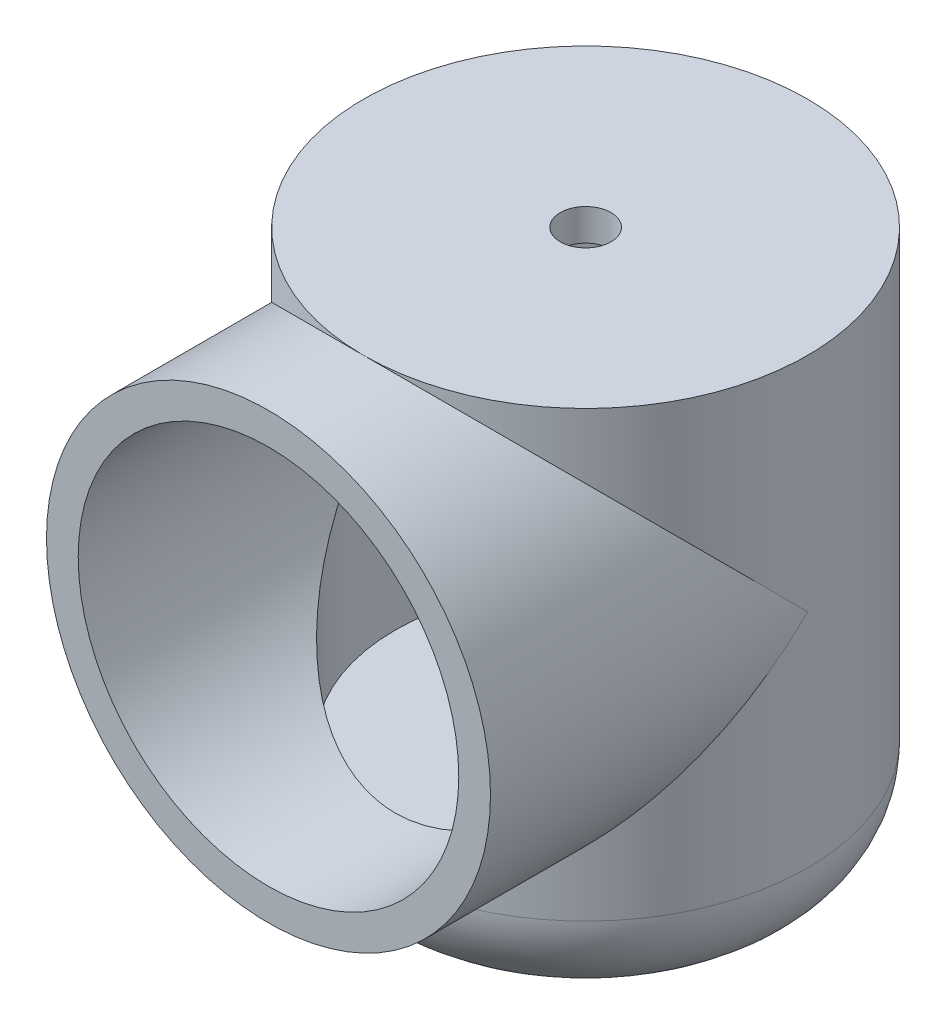
ISO-10303-21;
HEADER;
FILE_DESCRIPTION(('STEP AP214'),'2;1');
FILE_NAME('part.step','',(''),(''),'','','');
FILE_SCHEMA(('AUTOMOTIVE_DESIGN { 1 0 10303 214 1 1 1 1 }'));
ENDSEC;
DATA;
#1=APPLICATION_CONTEXT('core data for automotive mechanical design processes');
#2=APPLICATION_PROTOCOL_DEFINITION('international standard','automotive_design',2000,#1);
#3=PRODUCT_CONTEXT('',#1,'mechanical');
#4=PRODUCT('Part','Part','',(#3));
#5=PRODUCT_RELATED_PRODUCT_CATEGORY('part','',(#4));
#6=PRODUCT_DEFINITION_FORMATION('','',#4);
#7=PRODUCT_DEFINITION_CONTEXT('part definition',#1,'design');
#8=PRODUCT_DEFINITION('design','',#6,#7);
#9=PRODUCT_DEFINITION_SHAPE('','',#8);
#10=(LENGTH_UNIT() NAMED_UNIT(*) SI_UNIT(.MILLI.,.METRE.));
#11=(NAMED_UNIT(*) PLANE_ANGLE_UNIT() SI_UNIT($,.RADIAN.));
#12=(NAMED_UNIT(*) SI_UNIT($,.STERADIAN.) SOLID_ANGLE_UNIT());
#13=UNCERTAINTY_MEASURE_WITH_UNIT(LENGTH_MEASURE(1.E-05),#10,'distance_accuracy_value','');
#14=(GEOMETRIC_REPRESENTATION_CONTEXT(3) GLOBAL_UNCERTAINTY_ASSIGNED_CONTEXT((#13)) GLOBAL_UNIT_ASSIGNED_CONTEXT((#10,
#11,#12)) REPRESENTATION_CONTEXT('',''));
#15=CARTESIAN_POINT('',(0.,0.,0.));
#16=DIRECTION('',(0.,0.,1.));
#17=DIRECTION('',(1.,0.,0.));
#18=AXIS2_PLACEMENT_3D('',#15,#16,#17);
#19=CARTESIAN_POINT('',(0.,15.,0.));
#20=DIRECTION('',(0.,1.,0.));
#21=DIRECTION('',(0.,0.,1.));
#22=AXIS2_PLACEMENT_3D('',#19,#20,#21);
#23=CYLINDRICAL_SURFACE('',#22,30.);
#24=CARTESIAN_POINT('',(0.,15.,0.));
#25=DIRECTION('',(0.,1.,0.));
#26=DIRECTION('',(0.,0.,1.));
#27=AXIS2_PLACEMENT_3D('',#24,#25,#26);
#28=CIRCLE('',#27,30.);
#29=CARTESIAN_POINT('',(0.,15.,30.));
#30=VERTEX_POINT('',#29);
#31=EDGE_CURVE('E92',#30,#30,#28,.T.);
#32=ORIENTED_EDGE('',*,*,#31,.F.);
#33=EDGE_LOOP('',(#32));
#34=FACE_BOUND('',#33,.T.);
#35=CARTESIAN_POINT('',(0.,50.,0.));
#36=DIRECTION('',(0.,0.707106781186547,-0.707106781186547));
#37=DIRECTION('',(0.,0.707106781186547,0.707106781186547));
#38=AXIS2_PLACEMENT_3D('',#35,#36,#37);
#39=ELLIPSE('',#38,42.4264068711928,30.);
#40=CARTESIAN_POINT('',(0.,80.,30.));
#41=VERTEX_POINT('',#40);
#42=CARTESIAN_POINT('',(30.,50.,0.));
#43=VERTEX_POINT('',#42);
#44=EDGE_CURVE('E47',#41,#43,#39,.T.);
#45=ORIENTED_EDGE('',*,*,#44,.F.);
#46=CARTESIAN_POINT('',(0.,80.,0.));
#47=DIRECTION('',(0.,1.,0.));
#48=DIRECTION('',(0.,0.,1.));
#49=AXIS2_PLACEMENT_3D('',#46,#47,#48);
#50=CIRCLE('',#49,30.);
#51=EDGE_CURVE('E85',#41,#41,#50,.T.);
#52=ORIENTED_EDGE('',*,*,#51,.T.);
#53=CARTESIAN_POINT('',(-30.,50.,0.));
#54=VERTEX_POINT('',#53);
#55=EDGE_CURVE('E11',#54,#41,#39,.T.);
#56=ORIENTED_EDGE('',*,*,#55,.F.);
#57=CARTESIAN_POINT('',(0.,50.,0.));
#58=DIRECTION('',(0.,0.707106781186547,0.707106781186547));
#59=DIRECTION('',(0.,0.707106781186547,-0.707106781186547));
#60=AXIS2_PLACEMENT_3D('',#57,#58,#59);
#61=ELLIPSE('',#60,42.4264068711928,30.);
#62=EDGE_CURVE('E81',#43,#54,#61,.F.);
#63=ORIENTED_EDGE('',*,*,#62,.F.);
#64=EDGE_LOOP('',(#45,#52,#56,#63));
#65=FACE_BOUND('',#64,.T.);
#66=ADVANCED_FACE('F41',(#34,#65),#23,.F.);
#67=CARTESIAN_POINT('',(0.,85.,0.));
#68=DIRECTION('',(0.,-1.,0.));
#69=DIRECTION('',(0.,0.,-1.));
#70=AXIS2_PLACEMENT_3D('',#67,#68,#69);
#71=CYLINDRICAL_SURFACE('',#70,35.);
#72=CARTESIAN_POINT('',(0.,50.,0.));
#73=DIRECTION('',(0.,0.707106781186547,0.707106781186547));
#74=DIRECTION('',(0.,-0.707106781186547,0.707106781186547));
#75=AXIS2_PLACEMENT_3D('',#72,#73,#74);
#76=ELLIPSE('',#75,49.4974746830583,35.);
#77=CARTESIAN_POINT('',(-35.,50.,0.));
#78=VERTEX_POINT('',#77);
#79=CARTESIAN_POINT('',(0.,15.,35.));
#80=VERTEX_POINT('',#79);
#81=EDGE_CURVE('E102',#78,#80,#76,.T.);
#82=ORIENTED_EDGE('',*,*,#81,.F.);
#83=CARTESIAN_POINT('',(0.,50.,0.));
#84=DIRECTION('',(0.,-0.707106781186547,0.707106781186547));
#85=DIRECTION('',(0.,0.707106781186547,0.707106781186547));
#86=AXIS2_PLACEMENT_3D('',#83,#84,#85);
#87=ELLIPSE('',#86,49.4974746830583,35.);
#88=CARTESIAN_POINT('',(0.,85.,35.));
#89=VERTEX_POINT('',#88);
#90=EDGE_CURVE('E64',#89,#78,#87,.T.);
#91=ORIENTED_EDGE('',*,*,#90,.F.);
#92=CARTESIAN_POINT('',(0.,85.,0.));
#93=DIRECTION('',(0.,1.,0.));
#94=DIRECTION('',(0.,0.,1.));
#95=AXIS2_PLACEMENT_3D('',#92,#93,#94);
#96=CIRCLE('',#95,35.);
#97=EDGE_CURVE('E91',#89,#89,#96,.T.);
#98=ORIENTED_EDGE('',*,*,#97,.F.);
#99=CARTESIAN_POINT('',(35.,50.,0.));
#100=VERTEX_POINT('',#99);
#101=EDGE_CURVE('E57',#100,#89,#87,.T.);
#102=ORIENTED_EDGE('',*,*,#101,.F.);
#103=EDGE_CURVE('E110',#80,#100,#76,.T.);
#104=ORIENTED_EDGE('',*,*,#103,.F.);
#105=CARTESIAN_POINT('',(0.,15.,0.));
#106=DIRECTION('',(0.,1.,0.));
#107=DIRECTION('',(0.,0.,1.));
#108=AXIS2_PLACEMENT_3D('',#105,#106,#107);
#109=CIRCLE('',#108,35.);
#110=EDGE_CURVE('E86',#80,#80,#109,.T.);
#111=ORIENTED_EDGE('',*,*,#110,.T.);
#112=EDGE_LOOP('',(#82,#91,#98,#102,#104,#111));
#113=FACE_BOUND('',#112,.T.);
#114=ADVANCED_FACE('F129',(#113),#71,.T.);
#115=CARTESIAN_POINT('',(0.,85.,0.));
#116=DIRECTION('',(0.,1.,0.));
#117=DIRECTION('',(0.,0.,1.));
#118=AXIS2_PLACEMENT_3D('',#115,#116,#117);
#119=PLANE('',#118);
#120=ORIENTED_EDGE('',*,*,#97,.T.);
#121=EDGE_LOOP('',(#120));
#122=FACE_BOUND('',#121,.T.);
#123=CARTESIAN_POINT('',(0.,85.,0.));
#124=DIRECTION('',(0.,1.,0.));
#125=DIRECTION('',(0.,0.,1.));
#126=AXIS2_PLACEMENT_3D('',#123,#124,#125);
#127=CIRCLE('',#126,4.);
#128=CARTESIAN_POINT('',(0.,85.,4.));
#129=VERTEX_POINT('',#128);
#130=EDGE_CURVE('E112',#129,#129,#127,.T.);
#131=ORIENTED_EDGE('',*,*,#130,.F.);
#132=EDGE_LOOP('',(#131));
#133=FACE_BOUND('',#132,.T.);
#134=ADVANCED_FACE('F127',(#122,#133),#119,.T.);
#135=CARTESIAN_POINT('',(0.,0.,0.));
#136=DIRECTION('',(0.,1.,0.));
#137=DIRECTION('',(0.,0.,1.));
#138=AXIS2_PLACEMENT_3D('',#135,#136,#137);
#139=PLANE('',#138);
#140=CARTESIAN_POINT('',(0.,0.,0.));
#141=DIRECTION('',(0.,1.,0.));
#142=DIRECTION('',(0.,0.,1.));
#143=AXIS2_PLACEMENT_3D('',#140,#141,#142);
#144=CIRCLE('',#143,20.);
#145=CARTESIAN_POINT('',(0.,0.,20.));
#146=VERTEX_POINT('',#145);
#147=EDGE_CURVE('E88',#146,#146,#144,.F.);
#148=ORIENTED_EDGE('',*,*,#147,.T.);
#149=EDGE_LOOP('',(#148));
#150=FACE_BOUND('',#149,.T.);
#151=ADVANCED_FACE('F126',(#150),#139,.F.);
#152=CARTESIAN_POINT('',(0.,15.,0.));
#153=DIRECTION('',(0.,1.,0.));
#154=DIRECTION('',(0.,0.,1.));
#155=AXIS2_PLACEMENT_3D('',#152,#153,#154);
#156=PLANE('',#155);
#157=ORIENTED_EDGE('',*,*,#31,.T.);
#158=EDGE_LOOP('',(#157));
#159=FACE_BOUND('',#158,.T.);
#160=ADVANCED_FACE('F137',(#159),#156,.T.);
#161=CARTESIAN_POINT('',(0.,15.,0.));
#162=DIRECTION('',(0.,1.,0.));
#163=DIRECTION('',(0.,0.,1.));
#164=AXIS2_PLACEMENT_3D('',#161,#162,#163);
#165=TOROIDAL_SURFACE('',#164,20.,15.);
#166=ORIENTED_EDGE('',*,*,#147,.F.);
#167=EDGE_LOOP('',(#166));
#168=FACE_BOUND('',#167,.T.);
#169=ORIENTED_EDGE('',*,*,#110,.F.);
#170=EDGE_LOOP('',(#169));
#171=FACE_BOUND('',#170,.T.);
#172=ADVANCED_FACE('F43',(#168,#171),#165,.T.);
#173=CARTESIAN_POINT('',(0.,50.,70.));
#174=DIRECTION('',(0.,0.,-1.));
#175=DIRECTION('',(-1.,0.,0.));
#176=AXIS2_PLACEMENT_3D('',#173,#174,#175);
#177=CYLINDRICAL_SURFACE('',#176,30.);
#178=ORIENTED_EDGE('',*,*,#55,.T.);
#179=ORIENTED_EDGE('',*,*,#44,.T.);
#180=ORIENTED_EDGE('',*,*,#62,.T.);
#181=EDGE_LOOP('',(#178,#179,#180));
#182=FACE_BOUND('',#181,.T.);
#183=CARTESIAN_POINT('',(0.,50.,50.));
#184=DIRECTION('',(0.,0.,1.));
#185=DIRECTION('',(1.,0.,0.));
#186=AXIS2_PLACEMENT_3D('',#183,#184,#185);
#187=CIRCLE('',#186,30.);
#188=CARTESIAN_POINT('',(30.,50.,50.));
#189=VERTEX_POINT('',#188);
#190=EDGE_CURVE('E101',#189,#189,#187,.T.);
#191=ORIENTED_EDGE('',*,*,#190,.T.);
#192=EDGE_LOOP('',(#191));
#193=FACE_BOUND('',#192,.T.);
#194=ADVANCED_FACE('F80',(#182,#193),#177,.F.);
#195=CARTESIAN_POINT('',(0.,50.,50.));
#196=DIRECTION('',(0.,0.,1.));
#197=DIRECTION('',(1.,0.,0.));
#198=AXIS2_PLACEMENT_3D('',#195,#196,#197);
#199=PLANE('',#198);
#200=CARTESIAN_POINT('',(0.,50.,50.));
#201=DIRECTION('',(0.,0.,1.));
#202=DIRECTION('',(1.,0.,0.));
#203=AXIS2_PLACEMENT_3D('',#200,#201,#202);
#204=CIRCLE('',#203,35.);
#205=CARTESIAN_POINT('',(35.,50.,50.));
#206=VERTEX_POINT('',#205);
#207=EDGE_CURVE('E98',#206,#206,#204,.T.);
#208=ORIENTED_EDGE('',*,*,#207,.T.);
#209=EDGE_LOOP('',(#208));
#210=FACE_BOUND('',#209,.T.);
#211=ORIENTED_EDGE('',*,*,#190,.F.);
#212=EDGE_LOOP('',(#211));
#213=FACE_BOUND('',#212,.T.);
#214=ADVANCED_FACE('F155',(#210,#213),#199,.T.);
#215=CARTESIAN_POINT('',(0.,50.,50.));
#216=DIRECTION('',(0.,0.,-1.));
#217=DIRECTION('',(-1.,0.,0.));
#218=AXIS2_PLACEMENT_3D('',#215,#216,#217);
#219=CYLINDRICAL_SURFACE('',#218,35.);
#220=ORIENTED_EDGE('',*,*,#207,.F.);
#221=EDGE_LOOP('',(#220));
#222=FACE_BOUND('',#221,.T.);
#223=ORIENTED_EDGE('',*,*,#81,.T.);
#224=ORIENTED_EDGE('',*,*,#103,.T.);
#225=ORIENTED_EDGE('',*,*,#101,.T.);
#226=ORIENTED_EDGE('',*,*,#90,.T.);
#227=EDGE_LOOP('',(#223,#224,#225,#226));
#228=FACE_BOUND('',#227,.T.);
#229=ADVANCED_FACE('F153',(#222,#228),#219,.T.);
#230=CARTESIAN_POINT('',(0.,80.,0.));
#231=DIRECTION('',(0.,1.,0.));
#232=DIRECTION('',(0.,0.,1.));
#233=AXIS2_PLACEMENT_3D('',#230,#231,#232);
#234=PLANE('',#233);
#235=CARTESIAN_POINT('',(0.,80.,0.));
#236=DIRECTION('',(0.,1.,0.));
#237=DIRECTION('',(0.,0.,1.));
#238=AXIS2_PLACEMENT_3D('',#235,#236,#237);
#239=CIRCLE('',#238,4.);
#240=CARTESIAN_POINT('',(0.,80.,4.));
#241=VERTEX_POINT('',#240);
#242=EDGE_CURVE('E109',#241,#241,#239,.T.);
#243=ORIENTED_EDGE('',*,*,#242,.T.);
#244=EDGE_LOOP('',(#243));
#245=FACE_BOUND('',#244,.T.);
#246=ORIENTED_EDGE('',*,*,#51,.F.);
#247=EDGE_LOOP('',(#246));
#248=FACE_BOUND('',#247,.T.);
#249=ADVANCED_FACE('F119',(#245,#248),#234,.F.);
#250=CARTESIAN_POINT('',(0.,80.,0.));
#251=DIRECTION('',(0.,1.,0.));
#252=DIRECTION('',(0.,0.,1.));
#253=AXIS2_PLACEMENT_3D('',#250,#251,#252);
#254=CYLINDRICAL_SURFACE('',#253,4.);
#255=ORIENTED_EDGE('',*,*,#242,.F.);
#256=EDGE_LOOP('',(#255));
#257=FACE_BOUND('',#256,.T.);
#258=ORIENTED_EDGE('',*,*,#130,.T.);
#259=EDGE_LOOP('',(#258));
#260=FACE_BOUND('',#259,.T.);
#261=ADVANCED_FACE('F118',(#257,#260),#254,.F.);
#262=CLOSED_SHELL('',(#66,#114,#134,#151,#160,#172,#194,#214,#229,#249,#261));
#263=MANIFOLD_SOLID_BREP('B2',#262);
#264=ADVANCED_BREP_SHAPE_REPRESENTATION('',(#18,#263),#14);
#265=SHAPE_DEFINITION_REPRESENTATION(#9,#264);
ENDSEC;
END-ISO-10303-21;
